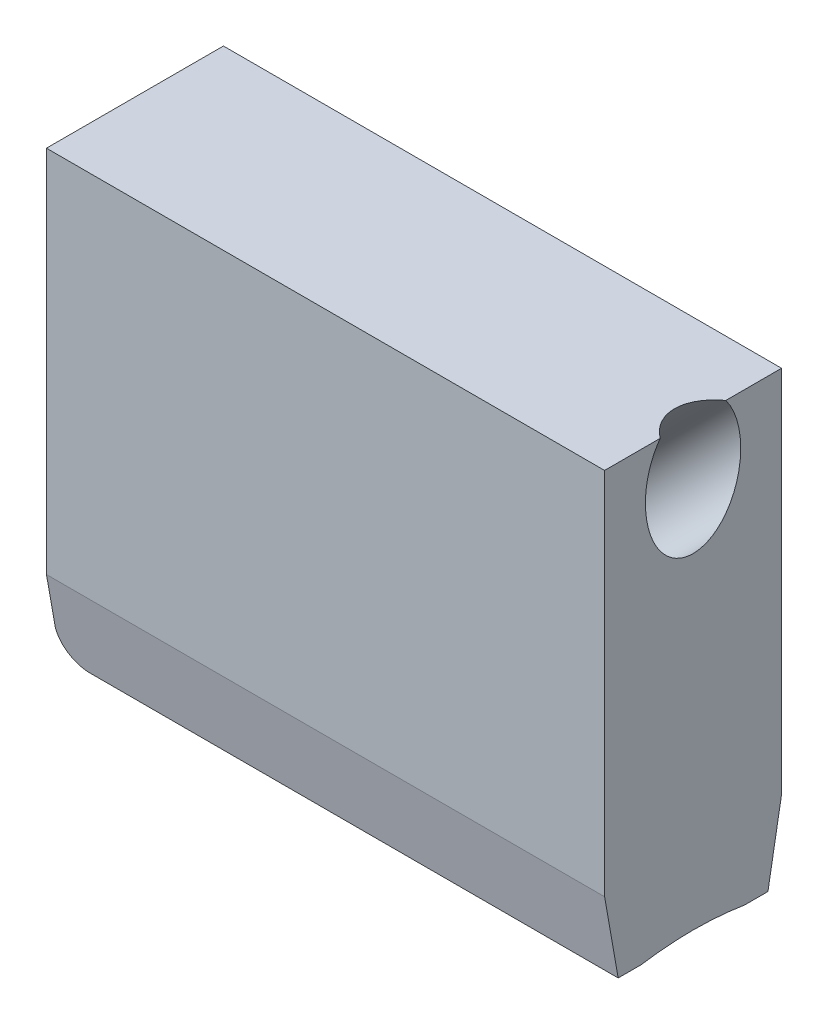
ISO-10303-21;
HEADER;
FILE_DESCRIPTION(('STEP AP214'),'2;1');
FILE_NAME('part.step','',(''),(''),'','','');
FILE_SCHEMA(('AUTOMOTIVE_DESIGN { 1 0 10303 214 1 1 1 1 }'));
ENDSEC;
DATA;
#1=APPLICATION_CONTEXT('core data for automotive mechanical design processes');
#2=APPLICATION_PROTOCOL_DEFINITION('international standard','automotive_design',2000,#1);
#3=PRODUCT_CONTEXT('',#1,'mechanical');
#4=PRODUCT('Part','Part','',(#3));
#5=PRODUCT_RELATED_PRODUCT_CATEGORY('part','',(#4));
#6=PRODUCT_DEFINITION_FORMATION('','',#4);
#7=PRODUCT_DEFINITION_CONTEXT('part definition',#1,'design');
#8=PRODUCT_DEFINITION('design','',#6,#7);
#9=PRODUCT_DEFINITION_SHAPE('','',#8);
#10=(LENGTH_UNIT() NAMED_UNIT(*) SI_UNIT(.MILLI.,.METRE.));
#11=(NAMED_UNIT(*) PLANE_ANGLE_UNIT() SI_UNIT($,.RADIAN.));
#12=(NAMED_UNIT(*) SI_UNIT($,.STERADIAN.) SOLID_ANGLE_UNIT());
#13=UNCERTAINTY_MEASURE_WITH_UNIT(LENGTH_MEASURE(1.E-05),#10,'distance_accuracy_value','');
#14=(GEOMETRIC_REPRESENTATION_CONTEXT(3) GLOBAL_UNCERTAINTY_ASSIGNED_CONTEXT((#13)) GLOBAL_UNIT_ASSIGNED_CONTEXT((#10,
#11,#12)) REPRESENTATION_CONTEXT('',''));
#15=CARTESIAN_POINT('',(0.,0.,0.));
#16=DIRECTION('',(0.,0.,1.));
#17=DIRECTION('',(1.,0.,0.));
#18=AXIS2_PLACEMENT_3D('',#15,#16,#17);
#19=CARTESIAN_POINT('',(-0.37592,29.999999944,-0.80247998));
#20=DIRECTION('',(-1.,0.,0.));
#21=DIRECTION('',(0.,0.,1.));
#22=AXIS2_PLACEMENT_3D('',#19,#20,#21);
#23=PLANE('',#22);
#24=DIRECTION('',(0.,1.,0.));
#25=VECTOR('',#24,1.);
#26=CARTESIAN_POINT('',(-0.37592,29.999999944,0.08255));
#27=LINE('',#26,#25);
#28=CARTESIAN_POINT('',(-0.375920000000002,0.0720252791091445,0.08255));
#29=VERTEX_POINT('',#28);
#30=CARTESIAN_POINT('',(-0.37592,0.416450285248574,0.08255));
#31=VERTEX_POINT('',#30);
#32=EDGE_CURVE('E384',#29,#31,#27,.T.);
#33=ORIENTED_EDGE('',*,*,#32,.T.);
#34=DIRECTION('',(0.,0.,-1.));
#35=VECTOR('',#34,1.);
#36=CARTESIAN_POINT('',(-0.37592,0.416450285248574,-0.80247998));
#37=LINE('',#36,#35);
#38=CARTESIAN_POINT('',(-0.37592,0.416450285248574,-0.08255));
#39=VERTEX_POINT('',#38);
#40=EDGE_CURVE('E66',#31,#39,#37,.T.);
#41=ORIENTED_EDGE('',*,*,#40,.T.);
#42=DIRECTION('',(0.,-1.,0.));
#43=VECTOR('',#42,1.);
#44=CARTESIAN_POINT('',(-0.37592,29.999999944,-0.08255));
#45=LINE('',#44,#43);
#46=CARTESIAN_POINT('',(-0.375920000000002,0.0720252791091445,-0.08255));
#47=VERTEX_POINT('',#46);
#48=EDGE_CURVE('E380',#39,#47,#45,.T.);
#49=ORIENTED_EDGE('',*,*,#48,.T.);
#50=DIRECTION('',(0.,-0.984807753012208,0.173648177666931));
#51=VECTOR('',#50,1.);
#52=CARTESIAN_POINT('',(-0.37592,29.2206763628594,-5.22224363732223));
#53=LINE('',#52,#51);
#54=CARTESIAN_POINT('',(-0.37592,0.0255594358987803,-0.0743568181606437));
#55=VERTEX_POINT('',#54);
#56=EDGE_CURVE('E233',#47,#55,#53,.T.);
#57=ORIENTED_EDGE('',*,*,#56,.T.);
#58=DIRECTION('',(0.,0.,-1.));
#59=VECTOR('',#58,1.);
#60=CARTESIAN_POINT('',(-0.37592,0.0255594358987817,37.6474733660194));
#61=LINE('',#60,#59);
#62=CARTESIAN_POINT('',(-0.375920000000074,0.0255595595870612,-0.0157980499526146));
#63=VERTEX_POINT('',#62);
#64=EDGE_CURVE('E193',#63,#55,#61,.T.);
#65=ORIENTED_EDGE('',*,*,#64,.F.);
#66=CARTESIAN_POINT('',(-0.37592,0.,0.0482432865795852));
#67=CARTESIAN_POINT('',(-0.37592,0.0149574693246277,0.0344039161936227));
#68=CARTESIAN_POINT('',(-0.37592,0.0292099999999983,0.0174815349681417));
#69=CARTESIAN_POINT('',(-0.37592,0.0292099999999983,-0.0174815349681413));
#70=CARTESIAN_POINT('',(-0.37592,0.0149574693246281,-0.0344039161936234));
#71=CARTESIAN_POINT('',(-0.37592,0.,-0.0482432865795854));
#72=(BOUNDED_CURVE() B_SPLINE_CURVE(3,(#66,#67,#68,#69,#70,#71),.UNSPECIFIED.,.F.,
.F.) B_SPLINE_CURVE_WITH_KNOTS((4,2,4),(1.41317404265068,1.5707963267949,1.72841861093912),
.UNSPECIFIED.) CURVE() GEOMETRIC_REPRESENTATION_ITEM() RATIONAL_B_SPLINE_CURVE((1.,1.,1.,1.,1.,1.)) REPRESENTATION_ITEM(''));
#73=CARTESIAN_POINT('',(-0.375920000000002,0.0255594691975284,0.0159098927846896));
#74=VERTEX_POINT('',#73);
#75=EDGE_CURVE('E402',#63,#74,#72,.F.);
#76=ORIENTED_EDGE('',*,*,#75,.T.);
#77=CARTESIAN_POINT('',(-0.37592,0.0255594358987837,0.0743568181606445));
#78=VERTEX_POINT('',#77);
#79=EDGE_CURVE('E339',#78,#74,#61,.T.);
#80=ORIENTED_EDGE('',*,*,#79,.F.);
#81=DIRECTION('',(0.,0.984807753012208,0.173648177666931));
#82=VECTOR('',#81,1.);
#83=CARTESIAN_POINT('',(-0.37592,28.9462120450838,5.17384817285665));
#84=LINE('',#83,#82);
#85=EDGE_CURVE('E236',#78,#29,#84,.T.);
#86=ORIENTED_EDGE('',*,*,#85,.T.);
#87=EDGE_LOOP('',(#33,#41,#49,#57,#65,#76,#80,#86));
#88=FACE_BOUND('',#87,.T.);
#89=ADVANCED_FACE('F47',(#88),#23,.T.);
#90=CARTESIAN_POINT('',(0.14478,0.,38.4527456938784));
#91=DIRECTION('',(-1.,0.,0.));
#92=DIRECTION('',(0.,0.,1.));
#93=AXIS2_PLACEMENT_3D('',#90,#91,#92);
#94=PLANE('',#93);
#95=DIRECTION('',(0.,0.,-1.));
#96=VECTOR('',#95,1.);
#97=CARTESIAN_POINT('',(0.14478,0.416450285248574,38.4527456938784));
#98=LINE('',#97,#96);
#99=CARTESIAN_POINT('',(0.14478,0.416450285248574,0.0825500000000007));
#100=VERTEX_POINT('',#99);
#101=CARTESIAN_POINT('',(0.14478,0.416450285248574,0.0305884527194784));
#102=VERTEX_POINT('',#101);
#103=EDGE_CURVE('E177',#100,#102,#98,.T.);
#104=ORIENTED_EDGE('',*,*,#103,.F.);
#105=DIRECTION('',(0.,1.,0.));
#106=VECTOR('',#105,1.);
#107=CARTESIAN_POINT('',(0.14478,0.,0.0825500000000007));
#108=LINE('',#107,#106);
#109=CARTESIAN_POINT('',(0.144779999999997,0.0720252791091445,0.08255));
#110=VERTEX_POINT('',#109);
#111=EDGE_CURVE('E382',#110,#100,#108,.T.);
#112=ORIENTED_EDGE('',*,*,#111,.F.);
#113=DIRECTION('',(0.,0.984807753012208,0.173648177666931));
#114=VECTOR('',#113,1.);
#115=CARTESIAN_POINT('',(0.14478,6.56386174323727,1.22723592297284));
#116=LINE('',#115,#114);
#117=CARTESIAN_POINT('',(0.14478,0.,0.0698500000000019));
#118=VERTEX_POINT('',#117);
#119=EDGE_CURVE('E245',#118,#110,#116,.T.);
#120=ORIENTED_EDGE('',*,*,#119,.F.);
#121=DIRECTION('',(0.,0.,-1.));
#122=VECTOR('',#121,1.);
#123=CARTESIAN_POINT('',(0.14478,0.,38.4527456938784));
#124=LINE('',#123,#122);
#125=CARTESIAN_POINT('',(0.144779999999997,0.,0.0482432865795852));
#126=VERTEX_POINT('',#125);
#127=EDGE_CURVE('E242',#118,#126,#124,.T.);
#128=ORIENTED_EDGE('',*,*,#127,.T.);
#129=CARTESIAN_POINT('',(0.144779999999997,-0.30353,0.));
#130=DIRECTION('',(-1.,0.,0.));
#131=DIRECTION('',(0.,0.,1.));
#132=AXIS2_PLACEMENT_3D('',#129,#130,#131);
#133=CIRCLE('',#132,0.30734);
#134=CARTESIAN_POINT('',(0.144779999999997,0.,-0.0482432865795852));
#135=VERTEX_POINT('',#134);
#136=EDGE_CURVE('E353',#126,#135,#133,.T.);
#137=ORIENTED_EDGE('',*,*,#136,.T.);
#138=CARTESIAN_POINT('',(0.144779999999997,0.,-0.06985));
#139=VERTEX_POINT('',#138);
#140=EDGE_CURVE('E235',#135,#139,#124,.T.);
#141=ORIENTED_EDGE('',*,*,#140,.T.);
#142=DIRECTION('',(0.,-0.984807753012208,0.173648177666931));
#143=VECTOR('',#142,1.);
#144=CARTESIAN_POINT('',(0.14478,-6.58775185024857,1.09174839341093));
#145=LINE('',#144,#143);
#146=CARTESIAN_POINT('',(0.14478,0.0720252791091437,-0.0825500000000087));
#147=VERTEX_POINT('',#146);
#148=EDGE_CURVE('E248',#147,#139,#145,.T.);
#149=ORIENTED_EDGE('',*,*,#148,.F.);
#150=DIRECTION('',(0.,-1.,0.));
#151=VECTOR('',#150,1.);
#152=CARTESIAN_POINT('',(0.14478,0.,-0.0825500000000007));
#153=LINE('',#152,#151);
#154=CARTESIAN_POINT('',(0.14478,0.416450285248574,-0.0825500000000007));
#155=VERTEX_POINT('',#154);
#156=EDGE_CURVE('E169',#155,#147,#153,.T.);
#157=ORIENTED_EDGE('',*,*,#156,.F.);
#158=CARTESIAN_POINT('',(0.14478,0.416450285248574,-0.0305884527194784));
#159=VERTEX_POINT('',#158);
#160=EDGE_CURVE('E173',#159,#155,#98,.T.);
#161=ORIENTED_EDGE('',*,*,#160,.F.);
#162=CARTESIAN_POINT('',(0.14478,0.370839999999998,0.));
#163=DIRECTION('',(-1.,0.,0.));
#164=DIRECTION('',(0.,1.,0.));
#165=AXIS2_PLACEMENT_3D('',#162,#163,#164);
#166=ELLIPSE('',#165,0.0628617928474839,0.0444500000000001);
#167=EDGE_CURVE('E164',#159,#102,#166,.T.);
#168=ORIENTED_EDGE('',*,*,#167,.T.);
#169=EDGE_LOOP('',(#104,#112,#120,#128,#137,#141,#149,#157,#161,#168));
#170=FACE_BOUND('',#169,.T.);
#171=ADVANCED_FACE('F174',(#170),#94,.F.);
#172=CARTESIAN_POINT('',(37.7616643023531,0.,-0.08255));
#173=DIRECTION('',(0.,0.,-1.));
#174=DIRECTION('',(-1.,0.,0.));
#175=AXIS2_PLACEMENT_3D('',#172,#173,#174);
#176=PLANE('',#175);
#177=ORIENTED_EDGE('',*,*,#48,.F.);
#178=DIRECTION('',(1.,0.,0.));
#179=VECTOR('',#178,1.);
#180=CARTESIAN_POINT('',(37.7616643023531,0.416450285248574,-0.08255));
#181=LINE('',#180,#179);
#182=EDGE_CURVE('E73',#39,#155,#181,.T.);
#183=ORIENTED_EDGE('',*,*,#182,.T.);
#184=ORIENTED_EDGE('',*,*,#156,.T.);
#185=DIRECTION('',(1.,0.,0.));
#186=VECTOR('',#185,1.);
#187=CARTESIAN_POINT('',(37.7616643023531,0.0720252791091445,-0.08255));
#188=LINE('',#187,#186);
#189=EDGE_CURVE('E251',#47,#147,#188,.T.);
#190=ORIENTED_EDGE('',*,*,#189,.F.);
#191=EDGE_LOOP('',(#177,#183,#184,#190));
#192=FACE_BOUND('',#191,.T.);
#193=ADVANCED_FACE('F404',(#192),#176,.T.);
#194=CARTESIAN_POINT('',(37.7616643023531,0.,0.08255));
#195=DIRECTION('',(0.,0.,1.));
#196=DIRECTION('',(1.,0.,0.));
#197=AXIS2_PLACEMENT_3D('',#194,#195,#196);
#198=PLANE('',#197);
#199=ORIENTED_EDGE('',*,*,#111,.T.);
#200=DIRECTION('',(-1.,0.,0.));
#201=VECTOR('',#200,1.);
#202=CARTESIAN_POINT('',(37.7616643023531,0.416450285248574,0.08255));
#203=LINE('',#202,#201);
#204=EDGE_CURVE('E181',#100,#31,#203,.T.);
#205=ORIENTED_EDGE('',*,*,#204,.T.);
#206=ORIENTED_EDGE('',*,*,#32,.F.);
#207=DIRECTION('',(-1.,0.,0.));
#208=VECTOR('',#207,1.);
#209=CARTESIAN_POINT('',(37.7616643023531,0.0720252791091445,0.08255));
#210=LINE('',#209,#208);
#211=EDGE_CURVE('E254',#110,#29,#210,.T.);
#212=ORIENTED_EDGE('',*,*,#211,.F.);
#213=EDGE_LOOP('',(#199,#205,#206,#212));
#214=FACE_BOUND('',#213,.T.);
#215=ADVANCED_FACE('F393',(#214),#198,.T.);
#216=CARTESIAN_POINT('',(-0.333371792847487,-0.107311792847484,0.));
#217=DIRECTION('',(0.707106781186551,0.707106781186544,0.));
#218=DIRECTION('',(-0.707106781186544,0.707106781186551,0.));
#219=AXIS2_PLACEMENT_3D('',#216,#217,#218);
#220=CYLINDRICAL_SURFACE('',#219,0.0444500000000001);
#221=CARTESIAN_POINT('',(-0.0838200000000001,0.14224,0.));
#222=DIRECTION('',(1.,0.,0.));
#223=DIRECTION('',(0.,1.,0.));
#224=AXIS2_PLACEMENT_3D('',#221,#222,#223);
#225=ELLIPSE('',#224,0.0628617928474839,0.0444500000000001);
#226=CARTESIAN_POINT('',(-0.0838200000000001,0.14224,-0.0444500000000014));
#227=VERTEX_POINT('',#226);
#228=CARTESIAN_POINT('',(-0.0838200000000001,0.14224,0.04445));
#229=VERTEX_POINT('',#228);
#230=EDGE_CURVE('E358',#227,#229,#225,.F.);
#231=ORIENTED_EDGE('',*,*,#230,.T.);
#232=CARTESIAN_POINT('',(-0.0838200000000001,0.14224,0.));
#233=DIRECTION('',(0.,1.,0.));
#234=DIRECTION('',(1.,0.,0.));
#235=AXIS2_PLACEMENT_3D('',#232,#233,#234);
#236=ELLIPSE('',#235,0.0628617928474846,0.0444500000000001);
#237=EDGE_CURVE('E355',#229,#227,#236,.F.);
#238=ORIENTED_EDGE('',*,*,#237,.T.);
#239=EDGE_LOOP('',(#231,#238));
#240=FACE_BOUND('',#239,.T.);
#241=CARTESIAN_POINT('',(0.190390285248576,0.416450285248574,0.));
#242=DIRECTION('',(0.,1.,0.));
#243=DIRECTION('',(1.,0.,0.));
#244=AXIS2_PLACEMENT_3D('',#241,#242,#243);
#245=ELLIPSE('',#244,0.0628617928474846,0.0444500000000001);
#246=EDGE_CURVE('E13',#102,#159,#245,.F.);
#247=ORIENTED_EDGE('',*,*,#246,.F.);
#248=ORIENTED_EDGE('',*,*,#167,.F.);
#249=EDGE_LOOP('',(#247,#248));
#250=FACE_BOUND('',#249,.T.);
#251=ADVANCED_FACE('F166',(#240,#250),#220,.F.);
#252=CARTESIAN_POINT('',(37.7616643023531,0.,0.06985));
#253=DIRECTION('',(0.,-0.173648177666931,0.984807753012208));
#254=DIRECTION('',(0.,-0.984807753012208,-0.173648177666931));
#255=AXIS2_PLACEMENT_3D('',#252,#253,#254);
#256=PLANE('',#255);
#257=CARTESIAN_POINT('',(-0.3480816,0.02794,0.0747765758409985));
#258=DIRECTION('',(0.,-0.173648177666931,0.984807753012208));
#259=DIRECTION('',(0.,-0.984807753012208,-0.173648177666931));
#260=AXIS2_PLACEMENT_3D('',#257,#258,#259);
#261=ELLIPSE('',#260,0.0283710195360877,0.02794);
#262=CARTESIAN_POINT('',(-0.3480816,0.,0.069850000000004));
#263=VERTEX_POINT('',#262);
#264=EDGE_CURVE('E345',#263,#78,#261,.F.);
#265=ORIENTED_EDGE('',*,*,#264,.F.);
#266=DIRECTION('',(-1.,0.,0.));
#267=VECTOR('',#266,1.);
#268=CARTESIAN_POINT('',(37.7616643023531,0.,0.06985));
#269=LINE('',#268,#267);
#270=EDGE_CURVE('E386',#118,#263,#269,.T.);
#271=ORIENTED_EDGE('',*,*,#270,.F.);
#272=ORIENTED_EDGE('',*,*,#119,.T.);
#273=ORIENTED_EDGE('',*,*,#211,.T.);
#274=ORIENTED_EDGE('',*,*,#85,.F.);
#275=EDGE_LOOP('',(#265,#271,#272,#273,#274));
#276=FACE_BOUND('',#275,.T.);
#277=ADVANCED_FACE('F394',(#276),#256,.T.);
#278=CARTESIAN_POINT('',(37.7616643023531,0.,-0.06985));
#279=DIRECTION('',(0.,-0.173648177666931,-0.984807753012208));
#280=DIRECTION('',(0.,0.984807753012208,-0.173648177666931));
#281=AXIS2_PLACEMENT_3D('',#278,#279,#280);
#282=PLANE('',#281);
#283=CARTESIAN_POINT('',(-0.3480816,0.02794,-0.0747765758409985));
#284=DIRECTION('',(0.,-0.173648177666931,-0.984807753012208));
#285=DIRECTION('',(0.,0.984807753012208,-0.173648177666931));
#286=AXIS2_PLACEMENT_3D('',#283,#284,#285);
#287=ELLIPSE('',#286,0.0283710195360877,0.02794);
#288=CARTESIAN_POINT('',(-0.3480816,0.,-0.069850000000004));
#289=VERTEX_POINT('',#288);
#290=EDGE_CURVE('E333',#55,#289,#287,.F.);
#291=ORIENTED_EDGE('',*,*,#290,.F.);
#292=ORIENTED_EDGE('',*,*,#56,.F.);
#293=ORIENTED_EDGE('',*,*,#189,.T.);
#294=ORIENTED_EDGE('',*,*,#148,.T.);
#295=DIRECTION('',(-1.,0.,0.));
#296=VECTOR('',#295,1.);
#297=CARTESIAN_POINT('',(37.7616643023531,0.,-0.06985));
#298=LINE('',#297,#296);
#299=EDGE_CURVE('E388',#139,#289,#298,.T.);
#300=ORIENTED_EDGE('',*,*,#299,.T.);
#301=EDGE_LOOP('',(#291,#292,#293,#294,#300));
#302=FACE_BOUND('',#301,.T.);
#303=ADVANCED_FACE('F319',(#302),#282,.T.);
#304=CARTESIAN_POINT('',(0.,0.,0.));
#305=DIRECTION('',(0.,1.,0.));
#306=DIRECTION('',(0.,0.,1.));
#307=AXIS2_PLACEMENT_3D('',#304,#305,#306);
#308=PLANE('',#307);
#309=ORIENTED_EDGE('',*,*,#270,.T.);
#310=DIRECTION('',(0.,0.,-1.));
#311=VECTOR('',#310,1.);
#312=CARTESIAN_POINT('',(-0.3480816,0.,37.6474733660194));
#313=LINE('',#312,#311);
#314=CARTESIAN_POINT('',(-0.348081600000001,0.,0.0482432865795852));
#315=VERTEX_POINT('',#314);
#316=EDGE_CURVE('E190',#263,#315,#313,.T.);
#317=ORIENTED_EDGE('',*,*,#316,.T.);
#318=DIRECTION('',(-1.,0.,0.));
#319=VECTOR('',#318,1.);
#320=CARTESIAN_POINT('',(37.7616643023531,0.,0.0482432865795852));
#321=LINE('',#320,#319);
#322=EDGE_CURVE('E264',#126,#315,#321,.T.);
#323=ORIENTED_EDGE('',*,*,#322,.F.);
#324=ORIENTED_EDGE('',*,*,#127,.F.);
#325=EDGE_LOOP('',(#309,#317,#323,#324));
#326=FACE_BOUND('',#325,.T.);
#327=ADVANCED_FACE('F310',(#326),#308,.F.);
#328=DIRECTION('',(-1.,0.,0.));
#329=VECTOR('',#328,1.);
#330=CARTESIAN_POINT('',(37.7616643023531,0.,-0.0482432865795852));
#331=LINE('',#330,#329);
#332=CARTESIAN_POINT('',(-0.348081600000001,0.,-0.0482432865795852));
#333=VERTEX_POINT('',#332);
#334=EDGE_CURVE('E323',#135,#333,#331,.T.);
#335=ORIENTED_EDGE('',*,*,#334,.T.);
#336=EDGE_CURVE('E188',#333,#289,#313,.T.);
#337=ORIENTED_EDGE('',*,*,#336,.T.);
#338=ORIENTED_EDGE('',*,*,#299,.F.);
#339=ORIENTED_EDGE('',*,*,#140,.F.);
#340=EDGE_LOOP('',(#335,#337,#338,#339));
#341=FACE_BOUND('',#340,.T.);
#342=ADVANCED_FACE('F307',(#341),#308,.F.);
#343=CARTESIAN_POINT('',(-0.204897697710467,0.14224,0.04445));
#344=DIRECTION('',(0.,-1.,0.));
#345=DIRECTION('',(0.,0.,-1.));
#346=AXIS2_PLACEMENT_3D('',#343,#344,#345);
#347=PLANE('',#346);
#348=DIRECTION('',(-1.,0.,0.));
#349=VECTOR('',#348,1.);
#350=CARTESIAN_POINT('',(-0.204897697710467,0.14224,0.04445));
#351=LINE('',#350,#349);
#352=CARTESIAN_POINT('',(-0.204897697710467,0.14224,0.04445));
#353=VERTEX_POINT('',#352);
#354=EDGE_CURVE('E362',#229,#353,#351,.T.);
#355=ORIENTED_EDGE('',*,*,#354,.T.);
#356=DIRECTION('',(0.,0.,-1.));
#357=VECTOR('',#356,1.);
#358=CARTESIAN_POINT('',(-0.204897697710467,0.14224,0.04445));
#359=LINE('',#358,#357);
#360=CARTESIAN_POINT('',(-0.204897697710467,0.14224,-0.04445));
#361=VERTEX_POINT('',#360);
#362=EDGE_CURVE('E170',#353,#361,#359,.T.);
#363=ORIENTED_EDGE('',*,*,#362,.T.);
#364=DIRECTION('',(-1.,0.,0.));
#365=VECTOR('',#364,1.);
#366=CARTESIAN_POINT('',(-0.204897697710467,0.14224,-0.04445));
#367=LINE('',#366,#365);
#368=EDGE_CURVE('E361',#227,#361,#367,.T.);
#369=ORIENTED_EDGE('',*,*,#368,.F.);
#370=ORIENTED_EDGE('',*,*,#237,.F.);
#371=EDGE_LOOP('',(#355,#363,#369,#370));
#372=FACE_BOUND('',#371,.T.);
#373=ADVANCED_FACE('F309',(#372),#347,.T.);
#374=CARTESIAN_POINT('',(-0.28702,0.,0.04445));
#375=DIRECTION('',(0.866025403784437,-0.500000000000004,0.));
#376=DIRECTION('',(0.500000000000004,0.866025403784436,0.));
#377=AXIS2_PLACEMENT_3D('',#374,#375,#376);
#378=PLANE('',#377);
#379=CARTESIAN_POINT('',(-0.462263127207124,-0.30353,0.));
#380=DIRECTION('',(0.866025403784437,-0.500000000000004,0.));
#381=DIRECTION('',(-0.500000000000004,-0.866025403784436,0.));
#382=AXIS2_PLACEMENT_3D('',#379,#380,#381);
#383=ELLIPSE('',#382,0.35488566346548,0.30734);
#384=CARTESIAN_POINT('',(-0.286685914277885,0.000578653444785084,-0.04445));
#385=VERTEX_POINT('',#384);
#386=CARTESIAN_POINT('',(-0.286685914277885,0.000578653444786342,0.04445));
#387=VERTEX_POINT('',#386);
#388=EDGE_CURVE('E349',#385,#387,#383,.T.);
#389=ORIENTED_EDGE('',*,*,#388,.F.);
#390=DIRECTION('',(-0.500000000000004,-0.866025403784436,0.));
#391=VECTOR('',#390,1.);
#392=CARTESIAN_POINT('',(-0.28702,0.,-0.04445));
#393=LINE('',#392,#391);
#394=EDGE_CURVE('E373',#361,#385,#393,.T.);
#395=ORIENTED_EDGE('',*,*,#394,.F.);
#396=ORIENTED_EDGE('',*,*,#362,.F.);
#397=DIRECTION('',(-0.500000000000004,-0.866025403784436,0.));
#398=VECTOR('',#397,1.);
#399=CARTESIAN_POINT('',(-0.28702,0.,0.04445));
#400=LINE('',#399,#398);
#401=EDGE_CURVE('E365',#353,#387,#400,.T.);
#402=ORIENTED_EDGE('',*,*,#401,.T.);
#403=EDGE_LOOP('',(#389,#395,#396,#402));
#404=FACE_BOUND('',#403,.T.);
#405=ADVANCED_FACE('F316',(#404),#378,.T.);
#406=CARTESIAN_POINT('',(-0.0838200000000001,0.14224,0.04445));
#407=DIRECTION('',(-1.,0.,0.));
#408=DIRECTION('',(0.,0.,1.));
#409=AXIS2_PLACEMENT_3D('',#406,#407,#408);
#410=PLANE('',#409);
#411=CARTESIAN_POINT('',(-0.0838199999999983,-0.30353,0.));
#412=DIRECTION('',(-1.,0.,0.));
#413=DIRECTION('',(0.,0.,1.));
#414=AXIS2_PLACEMENT_3D('',#411,#412,#413);
#415=CIRCLE('',#414,0.30734);
#416=CARTESIAN_POINT('',(-0.0838199999999983,0.000578653444784387,0.04445));
#417=VERTEX_POINT('',#416);
#418=CARTESIAN_POINT('',(-0.0838200000000001,0.000578653444784387,-0.04445));
#419=VERTEX_POINT('',#418);
#420=EDGE_CURVE('E328',#417,#419,#415,.T.);
#421=ORIENTED_EDGE('',*,*,#420,.F.);
#422=DIRECTION('',(0.,1.,0.));
#423=VECTOR('',#422,1.);
#424=CARTESIAN_POINT('',(-0.0838200000000001,0.14224,0.04445));
#425=LINE('',#424,#423);
#426=EDGE_CURVE('E369',#417,#229,#425,.T.);
#427=ORIENTED_EDGE('',*,*,#426,.T.);
#428=ORIENTED_EDGE('',*,*,#230,.F.);
#429=DIRECTION('',(0.,1.,0.));
#430=VECTOR('',#429,1.);
#431=CARTESIAN_POINT('',(-0.0838200000000001,0.14224,-0.04445));
#432=LINE('',#431,#430);
#433=EDGE_CURVE('E366',#419,#227,#432,.T.);
#434=ORIENTED_EDGE('',*,*,#433,.F.);
#435=EDGE_LOOP('',(#421,#427,#428,#434));
#436=FACE_BOUND('',#435,.T.);
#437=ADVANCED_FACE('F538',(#436),#410,.T.);
#438=CARTESIAN_POINT('',(0.,0.,0.04445));
#439=DIRECTION('',(0.,0.,-1.));
#440=DIRECTION('',(-1.,0.,0.));
#441=AXIS2_PLACEMENT_3D('',#438,#439,#440);
#442=PLANE('',#441);
#443=DIRECTION('',(-1.,0.,0.));
#444=VECTOR('',#443,1.);
#445=CARTESIAN_POINT('',(37.7616643023531,0.000578653444784387,0.04445));
#446=LINE('',#445,#444);
#447=EDGE_CURVE('E351',#387,#417,#446,.F.);
#448=ORIENTED_EDGE('',*,*,#447,.F.);
#449=ORIENTED_EDGE('',*,*,#401,.F.);
#450=ORIENTED_EDGE('',*,*,#354,.F.);
#451=ORIENTED_EDGE('',*,*,#426,.F.);
#452=EDGE_LOOP('',(#448,#449,#450,#451));
#453=FACE_BOUND('',#452,.T.);
#454=ADVANCED_FACE('F528',(#453),#442,.T.);
#455=CARTESIAN_POINT('',(0.,0.,-0.04445));
#456=DIRECTION('',(0.,0.,-1.));
#457=DIRECTION('',(-1.,0.,0.));
#458=AXIS2_PLACEMENT_3D('',#455,#456,#457);
#459=PLANE('',#458);
#460=ORIENTED_EDGE('',*,*,#394,.T.);
#461=DIRECTION('',(-1.,0.,0.));
#462=VECTOR('',#461,1.);
#463=CARTESIAN_POINT('',(37.7616643023531,0.000578653444784387,-0.04445));
#464=LINE('',#463,#462);
#465=EDGE_CURVE('E256',#385,#419,#464,.F.);
#466=ORIENTED_EDGE('',*,*,#465,.T.);
#467=ORIENTED_EDGE('',*,*,#433,.T.);
#468=ORIENTED_EDGE('',*,*,#368,.T.);
#469=EDGE_LOOP('',(#460,#466,#467,#468));
#470=FACE_BOUND('',#469,.T.);
#471=ADVANCED_FACE('F440',(#470),#459,.F.);
#472=CARTESIAN_POINT('',(37.7616643023531,-0.30353,0.));
#473=DIRECTION('',(-1.,0.,0.));
#474=DIRECTION('',(0.,0.,1.));
#475=AXIS2_PLACEMENT_3D('',#472,#473,#474);
#476=CYLINDRICAL_SURFACE('',#475,0.30734);
#477=ORIENTED_EDGE('',*,*,#388,.T.);
#478=ORIENTED_EDGE('',*,*,#447,.T.);
#479=ORIENTED_EDGE('',*,*,#420,.T.);
#480=ORIENTED_EDGE('',*,*,#465,.F.);
#481=EDGE_LOOP('',(#477,#478,#479,#480));
#482=FACE_BOUND('',#481,.T.);
#483=ORIENTED_EDGE('',*,*,#322,.T.);
#484=CARTESIAN_POINT('',(-0.3480816,0.,0.0482432865795852));
#485=CARTESIAN_POINT('',(-0.348353896644925,-1.31195659413845E-07,0.0482440492475037));
#486=CARTESIAN_POINT('',(-0.348625145505448,3.97529791392168E-06,0.0482182784555703));
#487=CARTESIAN_POINT('',(-0.349155683948038,1.94428443583035E-05,0.048120840241617));
#488=CARTESIAN_POINT('',(-0.349415081002626,3.07120542223101E-05,0.0480497538396697));
#489=CARTESIAN_POINT('',(-0.349988343277128,6.32629122701585E-05,0.0478436938858759));
#490=CARTESIAN_POINT('',(-0.350297639020315,8.64427631084168E-05,0.0476965466679439));
#491=CARTESIAN_POINT('',(-0.350889627579429,0.000139867694047368,0.0473552263029248));
#492=CARTESIAN_POINT('',(-0.351172165232969,0.000170150815958217,0.0471607997362598));
#493=CARTESIAN_POINT('',(-0.351899278633356,0.000258175405523819,0.0465912997969799));
#494=CARTESIAN_POINT('',(-0.352318643441584,0.000320286556949015,0.0461851188543543));
#495=CARTESIAN_POINT('',(-0.353095003074285,0.000450697484912912,0.0453189645180811));
#496=CARTESIAN_POINT('',(-0.353451855395906,0.000519010875775184,0.0448588721094141));
#497=CARTESIAN_POINT('',(-0.354725295048138,0.000783914898953182,0.0430431737934967));
#498=CARTESIAN_POINT('',(-0.355481422665012,0.000988154478954843,0.0415787296435387));
#499=CARTESIAN_POINT('',(-0.356793918863868,0.00138509178339327,0.0385625320679882));
#500=CARTESIAN_POINT('',(-0.357348987378443,0.00157770790674325,0.0370102829147655));
#501=CARTESIAN_POINT('',(-0.359422749792044,0.00234562067939245,0.0303893376374605));
#502=CARTESIAN_POINT('',(-0.360359370424909,0.00282567245131377,0.0251321497342822));
#503=CARTESIAN_POINT('',(-0.361653536903057,0.00351278341625744,0.0145395203757778));
#504=CARTESIAN_POINT('',(-0.362008666355234,0.00371870279026332,0.00920384488122733));
#505=CARTESIAN_POINT('',(-0.362255817543677,0.00386120048145194,-0.00215201122801003));
#506=CARTESIAN_POINT('',(-0.362084228750261,0.00376079301183634,-0.00817418080146216));
#507=CARTESIAN_POINT('',(-0.361100730647652,0.00320709071523552,-0.020132523540614));
#508=CARTESIAN_POINT('',(-0.360293591906012,0.00275642532114486,-0.0260690031870834));
#509=CARTESIAN_POINT('',(-0.358333695740426,0.0019446553581549,-0.0338747550375608));
#510=CARTESIAN_POINT('',(-0.357738888229639,0.00171300123613467,-0.0358996292027314));
#511=CARTESIAN_POINT('',(-0.35622392325202,0.00119745877491809,-0.0400446770350528));
#512=CARTESIAN_POINT('',(-0.355280193442108,0.000910792082540015,-0.0421580801913149));
#513=CARTESIAN_POINT('',(-0.353757130246412,0.00058152656403265,-0.0444320817022829));
#514=CARTESIAN_POINT('',(-0.353495251448074,0.000528075963328751,-0.0447961119259369));
#515=CARTESIAN_POINT('',(-0.352937379504986,0.000423669016665615,-0.0454990726214036));
#516=CARTESIAN_POINT('',(-0.352641318401944,0.000372717936702656,-0.0458379508131754));
#517=CARTESIAN_POINT('',(-0.352004997718422,0.00027494389173184,-0.0464816039815952));
#518=CARTESIAN_POINT('',(-0.351664222422041,0.000228181889394676,-0.046785888687382));
#519=CARTESIAN_POINT('',(-0.350934396873586,0.000143622369927999,-0.0473316207810336));
#520=CARTESIAN_POINT('',(-0.350545557507317,0.000105787671713063,-0.0475733292155798));
#521=CARTESIAN_POINT('',(-0.34988878459901,5.74282979151828E-05,-0.0478807134545133));
#522=CARTESIAN_POINT('',(-0.349636111485235,4.20567642306156E-05,-0.0479779895919409));
#523=CARTESIAN_POINT('',(-0.349118205835852,1.80496782489073E-05,-0.0481296519413832));
#524=CARTESIAN_POINT('',(-0.348853011991797,9.39465253074753E-06,-0.0481841621513266));
#525=CARTESIAN_POINT('',(-0.348418027274345,1.50783539033875E-06,-0.0482337960941237));
#526=CARTESIAN_POINT('',(-0.348249840178769,-4.30094660482885E-08,-0.0482435397422967));
#527=CARTESIAN_POINT('',(-0.3480816,0.,-0.0482432865795862));
#528=B_SPLINE_CURVE_WITH_KNOTS('',3,(#484,#485,#486,#487,#488,#489,#490,#491,#492,#493,#494,
#495,#496,#497,#498,#499,#500,#501,#502,#503,#504,#505,#506,#507,#508,#509,#510,#511,#512,#513,
#514,#515,#516,#517,#518,#519,#520,#521,#522,#523,#524,#525,#526,#527),.UNSPECIFIED.,.F.,.F.,(4,
2,2,2,2,2,2,2,2,2,2,2,2,2,2,2,2,2,2,2,2,4),(0.,0.000813951897065738,0.00161767193750729,
0.00264178770559884,0.00367151870355403,0.00542291670139487,0.00717825663544545,
0.0121215106148598,0.0170961804313095,0.0330671249043099,0.0491042699221516,0.0671510890543345,
0.085063721686428,0.0914325778752914,0.0983489113876431,0.0997021906160128,0.101058208212652,
0.102431526643176,0.103799020226142,0.104609536963543,0.10541769486763,0.105922115585613),.UNSPECIFIED.);
#529=CARTESIAN_POINT('',(-0.359948369548142,0.00265356665793947,0.0266317925959983));
#530=VERTEX_POINT('',#529);
#531=EDGE_CURVE('E337',#315,#530,#528,.T.);
#532=ORIENTED_EDGE('',*,*,#531,.T.);
#533=CARTESIAN_POINT('',(-0.37592,0.,-0.0482432865795854));
#534=CARTESIAN_POINT('',(-0.363217772431818,0.00253447256158176,-0.032297265668513));
#535=CARTESIAN_POINT('',(-0.35052,0.00380999999999999,-0.0161478491107738));
#536=CARTESIAN_POINT('',(-0.35052,0.00380999999999997,0.0161478491107741));
#537=CARTESIAN_POINT('',(-0.36321777243168,0.00253447256156472,0.0322972656686202));
#538=CARTESIAN_POINT('',(-0.37592,0.,0.0482432865795852));
#539=(BOUNDED_CURVE() B_SPLINE_CURVE(3,(#533,#534,#535,#536,#537,#538),.UNSPECIFIED.,.F.,
.F.) B_SPLINE_CURVE_WITH_KNOTS((4,2,4),(1.41317404265068,1.5707963267949,1.72841861093912),
.UNSPECIFIED.) CURVE() GEOMETRIC_REPRESENTATION_ITEM() RATIONAL_B_SPLINE_CURVE((1.,1.,1.,1.,1.,1.)) REPRESENTATION_ITEM(''));
#540=CARTESIAN_POINT('',(-0.359948332483138,0.00265356385673385,-0.0266318248372052));
#541=VERTEX_POINT('',#540);
#542=EDGE_CURVE('E260',#530,#541,#539,.F.);
#543=ORIENTED_EDGE('',*,*,#542,.T.);
#544=EDGE_CURVE('E191',#541,#333,#528,.T.);
#545=ORIENTED_EDGE('',*,*,#544,.T.);
#546=ORIENTED_EDGE('',*,*,#334,.F.);
#547=ORIENTED_EDGE('',*,*,#136,.F.);
#548=EDGE_LOOP('',(#483,#532,#543,#545,#546,#547));
#549=FACE_BOUND('',#548,.T.);
#550=ADVANCED_FACE('F204',(#482,#549),#476,.F.);
#551=CARTESIAN_POINT('',(-0.37592,0.,0.0482432865795852));
#552=CARTESIAN_POINT('',(-0.36321777243168,0.00253447256156472,0.0322972656686202));
#553=CARTESIAN_POINT('',(-0.35052,0.00380999999999997,0.0161478491107741));
#554=CARTESIAN_POINT('',(-0.35052,0.00380999999999999,-0.0161478491107738));
#555=CARTESIAN_POINT('',(-0.363217772431818,0.00253447256158176,-0.032297265668513));
#556=CARTESIAN_POINT('',(-0.37592,0.,-0.0482432865795854));
#557=CARTESIAN_POINT('',(-0.37592,0.,0.0482432865795852));
#558=CARTESIAN_POINT('',(-0.375920000000003,0.00253474750405598,0.0322955349393328));
#559=CARTESIAN_POINT('',(-0.375919999999998,0.00381000000000022,0.0161478491107741));
#560=CARTESIAN_POINT('',(-0.375919999999998,0.00381000000000006,-0.0161478491107737));
#561=CARTESIAN_POINT('',(-0.375920000000006,0.00253474750427336,-0.0322955349393677));
#562=CARTESIAN_POINT('',(-0.37592,0.,-0.0482432865795854));
#563=CARTESIAN_POINT('',(-0.37592,0.,0.0482432865795852));
#564=CARTESIAN_POINT('',(-0.37592,0.0149574693246277,0.0344039161936227));
#565=CARTESIAN_POINT('',(-0.37592,0.0292099999999983,0.0174815349681417));
#566=CARTESIAN_POINT('',(-0.37592,0.0292099999999983,-0.0174815349681413));
#567=CARTESIAN_POINT('',(-0.37592,0.0149574693246281,-0.0344039161936234));
#568=CARTESIAN_POINT('',(-0.37592,0.,-0.0482432865795854));
#569=(BOUNDED_SURFACE() B_SPLINE_SURFACE(2,3,((#551,#552,#553,#554,#555,#556),(#557,#558,#559,
#560,#561,#562),(#563,#564,#565,#566,#567,#568)),.UNSPECIFIED.,.F.,.F.,
.F.) B_SPLINE_SURFACE_WITH_KNOTS((3,3),(4,2,4),(0.,1.),(1.41317404265068,1.5707963267949,
1.72841861093912),.UNSPECIFIED.) GEOMETRIC_REPRESENTATION_ITEM() RATIONAL_B_SPLINE_SURFACE(((1.,
1.,1.,1.,1.,1.),(0.707106781186548,0.707106781186548,0.707106781186574,0.707106781186574,
0.707106781186548,0.707106781186548),(1.,1.,1.,1.,1.,1.))) REPRESENTATION_ITEM('') SURFACE());
#570=CARTESIAN_POINT('',(-0.375920000000004,0.0255594358988707,0.0158980523371656));
#571=CARTESIAN_POINT('',(-0.375917655449601,0.0255846462568868,0.0154382230591166));
#572=CARTESIAN_POINT('',(-0.375917011351345,0.0255419771911363,0.0149023812358612));
#573=CARTESIAN_POINT('',(-0.375894963678916,0.0252572400172317,0.0138155286074983));
#574=CARTESIAN_POINT('',(-0.375870916273715,0.0249903738123586,0.0132713386558579));
#575=CARTESIAN_POINT('',(-0.375754453462014,0.024072197723434,0.0124610750690245));
#576=CARTESIAN_POINT('',(-0.375648965577777,0.0233529742394241,0.0122754652380843));
#577=CARTESIAN_POINT('',(-0.375392602620724,0.0219946233953135,0.0121175009716652));
#578=CARTESIAN_POINT('',(-0.375243169863111,0.021353750684701,0.012138971619704));
#579=CARTESIAN_POINT('',(-0.374902193285126,0.0200866537816003,0.0122430141234795));
#580=CARTESIAN_POINT('',(-0.374711262735089,0.0194603497332634,0.0123247337848365));
#581=CARTESIAN_POINT('',(-0.373611149666794,0.0162581253466968,0.0128340825613894));
#582=CARTESIAN_POINT('',(-0.372356773753927,0.0138489533453579,0.0135324860033607));
#583=CARTESIAN_POINT('',(-0.369236006360385,0.00949310582294125,0.0153219016559649));
#584=CARTESIAN_POINT('',(-0.367349709616664,0.0075655946001959,0.0164258136145556));
#585=CARTESIAN_POINT('',(-0.364391565313219,0.00521229670365354,0.0188645890909406));
#586=CARTESIAN_POINT('',(-0.363318341466848,0.00449717700515867,0.0198959415850497));
#587=CARTESIAN_POINT('',(-0.361635852967933,0.00349060824701947,0.022163985328208));
#588=CARTESIAN_POINT('',(-0.36097946282613,0.00314907644511945,0.0233397348320135));
#589=CARTESIAN_POINT('',(-0.360273988032053,0.00279950385893599,0.0252662986866116));
#590=CARTESIAN_POINT('',(-0.360084518805534,0.00271012033864096,0.0259542271073334));
#591=CARTESIAN_POINT('',(-0.359960881983604,0.00265114356973575,0.0266581127953892));
#592=B_SPLINE_CURVE_WITH_KNOTS('',3,(#570,#571,#572,#573,#574,#575,#576,#577,#578,#579,#580,
#581,#582,#583,#584,#585,#586,#587,#588,#589,#590,#591),.UNSPECIFIED.,.F.,.F.,(4,2,2,2,2,2,2,2,
2,2,4),(0.,0.00151407805185413,0.00322175011335717,0.00528146977323468,0.0072799652829922,
0.00925072254310925,0.0175203960604078,0.0260798446543912,0.0309580883784628,0.0350405522745455,
0.0371870850836668),.UNSPECIFIED.);
#593=EDGE_CURVE('E59',#74,#530,#592,.T.);
#594=CARTESIAN_POINT('',(-0.359960881983742,0.00265114356973136,-0.0266581127954757));
#595=CARTESIAN_POINT('',(-0.360180567730524,0.00275544844815951,-0.0253331397153511));
#596=CARTESIAN_POINT('',(-0.360636151812229,0.00297015318403908,-0.0240958390659025));
#597=CARTESIAN_POINT('',(-0.361844018181033,0.00361490298880049,-0.021835730830221));
#598=CARTESIAN_POINT('',(-0.362596088818197,0.00404479450333615,-0.020812771030649));
#599=CARTESIAN_POINT('',(-0.364666848621409,0.00540678987052484,-0.0185284822836909));
#600=CARTESIAN_POINT('',(-0.366070657302744,0.00648495052409803,-0.017442136635705));
#601=CARTESIAN_POINT('',(-0.369255593201854,0.0095273013650423,-0.0152592277529743));
#602=CARTESIAN_POINT('',(-0.370964847106946,0.0116733339995131,-0.0143303065939178));
#603=CARTESIAN_POINT('',(-0.373435081796146,0.0159917095309019,-0.0129549199868208));
#604=CARTESIAN_POINT('',(-0.374317663234666,0.0180718803420737,-0.0124489880312041));
#605=CARTESIAN_POINT('',(-0.375110607363249,0.0208360370019969,-0.0121752299354906));
#606=CARTESIAN_POINT('',(-0.375260516701786,0.0214315173904868,-0.0121381975388508));
#607=CARTESIAN_POINT('',(-0.37552288308345,0.0226498485107276,-0.012168669585112));
#608=CARTESIAN_POINT('',(-0.375635005213645,0.0232728913272044,-0.0122370803438433));
#609=CARTESIAN_POINT('',(-0.375758336581894,0.0241042121193207,-0.0125755089207671));
#610=CARTESIAN_POINT('',(-0.37579119589061,0.024352930118451,-0.0127147616508829));
#611=CARTESIAN_POINT('',(-0.375842936869042,0.0247779957143447,-0.0130784154114959));
#612=CARTESIAN_POINT('',(-0.375861947623099,0.0249550046459787,-0.0133019998145087));
#613=CARTESIAN_POINT('',(-0.375894039259458,0.0252663338075893,-0.0138565561024211));
#614=CARTESIAN_POINT('',(-0.37590400482638,0.0253751272821204,-0.0142001046843099));
#615=CARTESIAN_POINT('',(-0.37591719751948,0.025529649884989,-0.0150005618167723));
#616=CARTESIAN_POINT('',(-0.375917966894607,0.0255513057781715,-0.0154635422756569));
#617=CARTESIAN_POINT('',(-0.37592,0.0255594358987824,-0.0158980523301951));
#618=B_SPLINE_CURVE_WITH_KNOTS('',3,(#594,#595,#596,#597,#598,#599,#600,#601,#602,#603,#604,
#605,#606,#607,#608,#609,#610,#611,#612,#613,#614,#615,#616,#617),.UNSPECIFIED.,.F.,.F.,(4,2,2,
2,2,2,2,2,2,2,2,4),(0.,0.00396039038092493,0.00791795870156395,0.0140371345828841,
0.02258907121081,0.0294203200405301,0.0312681004444997,0.0331318518742337,0.0339760172578974,
0.0348122096983308,0.0358807411723214,0.0372299603407857),.UNSPECIFIED.);
#619=EDGE_CURVE('E224',#541,#63,#618,.T.);
#620=ORIENTED_EDGE('',*,*,#593,.F.);
#621=ORIENTED_EDGE('',*,*,#75,.F.);
#622=ORIENTED_EDGE('',*,*,#619,.F.);
#623=ORIENTED_EDGE('',*,*,#542,.F.);
#624=EDGE_LOOP('',(#620,#621,#622,#623));
#625=FACE_BOUND('',#624,.T.);
#626=ADVANCED_FACE('F50',(#625),#569,.T.);
#627=CARTESIAN_POINT('',(-0.3480816,0.02794,37.6474733660194));
#628=DIRECTION('',(0.,0.,-1.));
#629=DIRECTION('',(-1.,0.,0.));
#630=AXIS2_PLACEMENT_3D('',#627,#628,#629);
#631=CYLINDRICAL_SURFACE('',#630,0.02794);
#632=ORIENTED_EDGE('',*,*,#64,.T.);
#633=ORIENTED_EDGE('',*,*,#290,.T.);
#634=ORIENTED_EDGE('',*,*,#336,.F.);
#635=ORIENTED_EDGE('',*,*,#544,.F.);
#636=ORIENTED_EDGE('',*,*,#619,.T.);
#637=EDGE_LOOP('',(#632,#633,#634,#635,#636));
#638=FACE_BOUND('',#637,.T.);
#639=ADVANCED_FACE('F207',(#638),#631,.T.);
#640=ORIENTED_EDGE('',*,*,#316,.F.);
#641=ORIENTED_EDGE('',*,*,#264,.T.);
#642=ORIENTED_EDGE('',*,*,#79,.T.);
#643=ORIENTED_EDGE('',*,*,#593,.T.);
#644=ORIENTED_EDGE('',*,*,#531,.F.);
#645=EDGE_LOOP('',(#640,#641,#642,#643,#644));
#646=FACE_BOUND('',#645,.T.);
#647=ADVANCED_FACE('F211',(#646),#631,.T.);
#648=CARTESIAN_POINT('',(0.,0.416450285248574,0.));
#649=DIRECTION('',(0.,1.,0.));
#650=DIRECTION('',(0.,0.,1.));
#651=AXIS2_PLACEMENT_3D('',#648,#649,#650);
#652=PLANE('',#651);
#653=ORIENTED_EDGE('',*,*,#40,.F.);
#654=ORIENTED_EDGE('',*,*,#204,.F.);
#655=ORIENTED_EDGE('',*,*,#103,.T.);
#656=ORIENTED_EDGE('',*,*,#246,.T.);
#657=ORIENTED_EDGE('',*,*,#160,.T.);
#658=ORIENTED_EDGE('',*,*,#182,.F.);
#659=EDGE_LOOP('',(#653,#654,#655,#656,#657,#658));
#660=FACE_BOUND('',#659,.T.);
#661=ADVANCED_FACE('F179',(#660),#652,.T.);
#662=CLOSED_SHELL('',(#89,#171,#193,#215,#251,#277,#303,#327,#342,#373,#405,#437,#454,#471,#550,
#626,#639,#647,#661));
#663=MANIFOLD_SOLID_BREP('B2',#662);
#664=ADVANCED_BREP_SHAPE_REPRESENTATION('',(#18,#663),#14);
#665=SHAPE_DEFINITION_REPRESENTATION(#9,#664);
ENDSEC;
END-ISO-10303-21;
